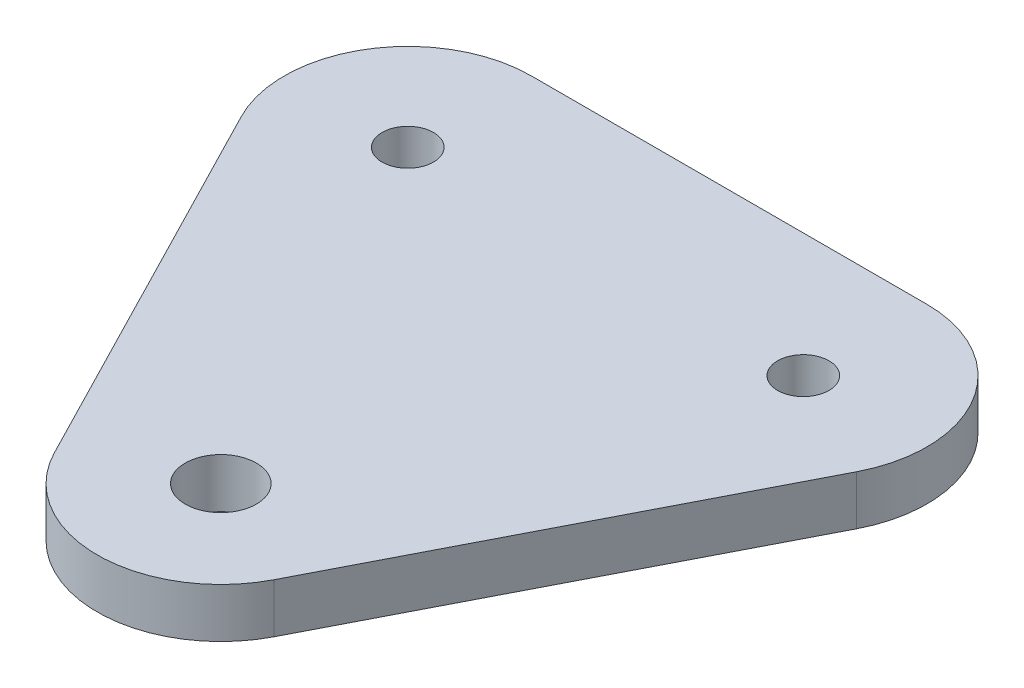
ISO-10303-21;
HEADER;
FILE_DESCRIPTION(('STEP AP214'),'2;1');
FILE_NAME('part.step','',(''),(''),'','','');
FILE_SCHEMA(('AUTOMOTIVE_DESIGN { 1 0 10303 214 1 1 1 1 }'));
ENDSEC;
DATA;
#1=APPLICATION_CONTEXT('core data for automotive mechanical design processes');
#2=APPLICATION_PROTOCOL_DEFINITION('international standard','automotive_design',2000,#1);
#3=PRODUCT_CONTEXT('',#1,'mechanical');
#4=PRODUCT('Part','Part','',(#3));
#5=PRODUCT_RELATED_PRODUCT_CATEGORY('part','',(#4));
#6=PRODUCT_DEFINITION_FORMATION('','',#4);
#7=PRODUCT_DEFINITION_CONTEXT('part definition',#1,'design');
#8=PRODUCT_DEFINITION('design','',#6,#7);
#9=PRODUCT_DEFINITION_SHAPE('','',#8);
#10=(LENGTH_UNIT() NAMED_UNIT(*) SI_UNIT(.MILLI.,.METRE.));
#11=(NAMED_UNIT(*) PLANE_ANGLE_UNIT() SI_UNIT($,.RADIAN.));
#12=(NAMED_UNIT(*) SI_UNIT($,.STERADIAN.) SOLID_ANGLE_UNIT());
#13=UNCERTAINTY_MEASURE_WITH_UNIT(LENGTH_MEASURE(1.E-05),#10,'distance_accuracy_value','');
#14=(GEOMETRIC_REPRESENTATION_CONTEXT(3) GLOBAL_UNCERTAINTY_ASSIGNED_CONTEXT((#13)) GLOBAL_UNIT_ASSIGNED_CONTEXT((#10,
#11,#12)) REPRESENTATION_CONTEXT('',''));
#15=CARTESIAN_POINT('',(0.,0.,0.));
#16=DIRECTION('',(0.,0.,1.));
#17=DIRECTION('',(1.,0.,0.));
#18=AXIS2_PLACEMENT_3D('',#15,#16,#17);
#19=CARTESIAN_POINT('',(-20.,5.,-14.314934837615));
#20=DIRECTION('',(0.,1.,0.));
#21=DIRECTION('',(0.,0.,1.));
#22=AXIS2_PLACEMENT_3D('',#19,#20,#21);
#23=PLANE('',#22);
#24=CARTESIAN_POINT('',(-20.,5.,-14.314934837615));
#25=DIRECTION('',(0.,1.,0.));
#26=DIRECTION('',(0.,0.,1.));
#27=AXIS2_PLACEMENT_3D('',#24,#25,#26);
#28=CIRCLE('',#27,2.59999999999999);
#29=CARTESIAN_POINT('',(-20.,5.,-11.714934837615));
#30=VERTEX_POINT('',#29);
#31=EDGE_CURVE('E211',#30,#30,#28,.T.);
#32=ORIENTED_EDGE('',*,*,#31,.F.);
#33=EDGE_LOOP('',(#32));
#34=FACE_BOUND('',#33,.T.);
#35=CARTESIAN_POINT('',(-20.,5.,-14.314934837615));
#36=DIRECTION('',(0.,1.,0.));
#37=DIRECTION('',(0.,0.,1.));
#38=AXIS2_PLACEMENT_3D('',#35,#36,#37);
#39=CIRCLE('',#38,12.5);
#40=CARTESIAN_POINT('',(-20.,5.,-26.814934837615));
#41=VERTEX_POINT('',#40);
#42=CARTESIAN_POINT('',(-31.117126255119,5.,-8.60008542334819));
#43=VERTEX_POINT('',#42);
#44=EDGE_CURVE('E150',#41,#43,#39,.T.);
#45=ORIENTED_EDGE('',*,*,#44,.T.);
#46=DIRECTION('',(0.45718795314135,0.,0.889370100409511));
#47=VECTOR('',#46,1.);
#48=CARTESIAN_POINT('',(-31.117126255119,5.,-8.60008542334819));
#49=LINE('',#48,#47);
#50=CARTESIAN_POINT('',(-11.1151221279727,5.,30.3099171187607));
#51=VERTEX_POINT('',#50);
#52=EDGE_CURVE('E98',#43,#51,#49,.T.);
#53=ORIENTED_EDGE('',*,*,#52,.T.);
#54=CARTESIAN_POINT('',(0.00200412714628038,5.,24.5950677044939));
#55=DIRECTION('',(0.,1.,0.));
#56=DIRECTION('',(0.,0.,1.));
#57=AXIS2_PLACEMENT_3D('',#54,#55,#56);
#58=CIRCLE('',#57,12.5000000000001);
#59=CARTESIAN_POINT('',(11.1195960194084,5.,30.3090112216376));
#60=VERTEX_POINT('',#59);
#61=EDGE_CURVE('E111',#51,#60,#58,.T.);
#62=ORIENTED_EDGE('',*,*,#61,.T.);
#63=DIRECTION('',(0.457115481371498,0.,-0.889407351380965));
#64=VECTOR('',#63,1.);
#65=CARTESIAN_POINT('',(11.1195960194084,5.,30.3090112216376));
#66=LINE('',#65,#64);
#67=CARTESIAN_POINT('',(31.1175918922621,5.,-8.60099132047127));
#68=VERTEX_POINT('',#67);
#69=EDGE_CURVE('E105',#60,#68,#66,.T.);
#70=ORIENTED_EDGE('',*,*,#69,.T.);
#71=CARTESIAN_POINT('',(20.,5.,-14.314934837615));
#72=DIRECTION('',(0.,1.,0.));
#73=DIRECTION('',(0.,0.,1.));
#74=AXIS2_PLACEMENT_3D('',#71,#72,#73);
#75=CIRCLE('',#74,12.5);
#76=CARTESIAN_POINT('',(20.,5.,-26.814934837615));
#77=VERTEX_POINT('',#76);
#78=EDGE_CURVE('E109',#68,#77,#75,.T.);
#79=ORIENTED_EDGE('',*,*,#78,.T.);
#80=DIRECTION('',(-1.,0.,0.));
#81=VECTOR('',#80,1.);
#82=CARTESIAN_POINT('',(20.,5.,-26.814934837615));
#83=LINE('',#82,#81);
#84=EDGE_CURVE('E61',#77,#41,#83,.T.);
#85=ORIENTED_EDGE('',*,*,#84,.T.);
#86=EDGE_LOOP('',(#45,#53,#62,#70,#79,#85));
#87=FACE_BOUND('',#86,.T.);
#88=CARTESIAN_POINT('',(20.,5.,-14.314934837615));
#89=DIRECTION('',(0.,1.,0.));
#90=DIRECTION('',(0.,0.,1.));
#91=AXIS2_PLACEMENT_3D('',#88,#89,#90);
#92=CIRCLE('',#91,2.59999999999997);
#93=CARTESIAN_POINT('',(20.,5.,-11.714934837615));
#94=VERTEX_POINT('',#93);
#95=EDGE_CURVE('E138',#94,#94,#92,.T.);
#96=ORIENTED_EDGE('',*,*,#95,.F.);
#97=EDGE_LOOP('',(#96));
#98=FACE_BOUND('',#97,.T.);
#99=CARTESIAN_POINT('',(0.00200412714628038,5.,24.5950677044939));
#100=DIRECTION('',(0.,1.,0.));
#101=DIRECTION('',(0.,0.,1.));
#102=AXIS2_PLACEMENT_3D('',#99,#100,#101);
#103=CIRCLE('',#102,3.6);
#104=CARTESIAN_POINT('',(0.00200412714628038,5.,28.1950677044939));
#105=VERTEX_POINT('',#104);
#106=EDGE_CURVE('E200',#105,#105,#103,.T.);
#107=ORIENTED_EDGE('',*,*,#106,.F.);
#108=EDGE_LOOP('',(#107));
#109=FACE_BOUND('',#108,.T.);
#110=ADVANCED_FACE('F43',(#34,#87,#98,#109),#23,.T.);
#111=CARTESIAN_POINT('',(-20.,0.,-14.314934837615));
#112=DIRECTION('',(0.,1.,0.));
#113=DIRECTION('',(0.,0.,1.));
#114=AXIS2_PLACEMENT_3D('',#111,#112,#113);
#115=PLANE('',#114);
#116=CARTESIAN_POINT('',(-20.,0.,-14.314934837615));
#117=DIRECTION('',(0.,1.,0.));
#118=DIRECTION('',(0.,0.,1.));
#119=AXIS2_PLACEMENT_3D('',#116,#117,#118);
#120=CIRCLE('',#119,12.5);
#121=CARTESIAN_POINT('',(-20.,0.,-26.814934837615));
#122=VERTEX_POINT('',#121);
#123=CARTESIAN_POINT('',(-31.117126255119,0.,-8.60008542334819));
#124=VERTEX_POINT('',#123);
#125=EDGE_CURVE('E133',#122,#124,#120,.T.);
#126=ORIENTED_EDGE('',*,*,#125,.F.);
#127=DIRECTION('',(-1.,0.,0.));
#128=VECTOR('',#127,1.);
#129=CARTESIAN_POINT('',(20.,0.,-26.814934837615));
#130=LINE('',#129,#128);
#131=CARTESIAN_POINT('',(20.,0.,-26.814934837615));
#132=VERTEX_POINT('',#131);
#133=EDGE_CURVE('E90',#132,#122,#130,.T.);
#134=ORIENTED_EDGE('',*,*,#133,.F.);
#135=CARTESIAN_POINT('',(20.,0.,-14.314934837615));
#136=DIRECTION('',(0.,1.,0.));
#137=DIRECTION('',(0.,0.,1.));
#138=AXIS2_PLACEMENT_3D('',#135,#136,#137);
#139=CIRCLE('',#138,12.5);
#140=CARTESIAN_POINT('',(31.1175918922621,0.,-8.60099132047127));
#141=VERTEX_POINT('',#140);
#142=EDGE_CURVE('E84',#141,#132,#139,.T.);
#143=ORIENTED_EDGE('',*,*,#142,.F.);
#144=DIRECTION('',(0.457115481371498,0.,-0.889407351380965));
#145=VECTOR('',#144,1.);
#146=CARTESIAN_POINT('',(11.1195960194084,0.,30.3090112216376));
#147=LINE('',#146,#145);
#148=CARTESIAN_POINT('',(11.1195960194084,0.,30.3090112216376));
#149=VERTEX_POINT('',#148);
#150=EDGE_CURVE('E120',#149,#141,#147,.T.);
#151=ORIENTED_EDGE('',*,*,#150,.F.);
#152=CARTESIAN_POINT('',(0.00200412714628038,0.,24.5950677044939));
#153=DIRECTION('',(0.,1.,0.));
#154=DIRECTION('',(0.,0.,1.));
#155=AXIS2_PLACEMENT_3D('',#152,#153,#154);
#156=CIRCLE('',#155,12.5000000000001);
#157=CARTESIAN_POINT('',(-11.1151221279727,0.,30.3099171187607));
#158=VERTEX_POINT('',#157);
#159=EDGE_CURVE('E141',#158,#149,#156,.T.);
#160=ORIENTED_EDGE('',*,*,#159,.F.);
#161=DIRECTION('',(0.45718795314135,0.,0.889370100409511));
#162=VECTOR('',#161,1.);
#163=CARTESIAN_POINT('',(-31.117126255119,0.,-8.60008542334819));
#164=LINE('',#163,#162);
#165=EDGE_CURVE('E137',#124,#158,#164,.T.);
#166=ORIENTED_EDGE('',*,*,#165,.F.);
#167=EDGE_LOOP('',(#126,#134,#143,#151,#160,#166));
#168=FACE_BOUND('',#167,.T.);
#169=CARTESIAN_POINT('',(20.,0.,-14.314934837615));
#170=DIRECTION('',(0.,1.,0.));
#171=DIRECTION('',(0.,0.,1.));
#172=AXIS2_PLACEMENT_3D('',#169,#170,#171);
#173=CIRCLE('',#172,2.59999999999997);
#174=CARTESIAN_POINT('',(20.,0.,-11.714934837615));
#175=VERTEX_POINT('',#174);
#176=EDGE_CURVE('E215',#175,#175,#173,.T.);
#177=ORIENTED_EDGE('',*,*,#176,.T.);
#178=EDGE_LOOP('',(#177));
#179=FACE_BOUND('',#178,.T.);
#180=CARTESIAN_POINT('',(-20.,0.,-14.314934837615));
#181=DIRECTION('',(0.,1.,0.));
#182=DIRECTION('',(0.,0.,1.));
#183=AXIS2_PLACEMENT_3D('',#180,#181,#182);
#184=CIRCLE('',#183,2.59999999999999);
#185=CARTESIAN_POINT('',(-20.,0.,-11.714934837615));
#186=VERTEX_POINT('',#185);
#187=EDGE_CURVE('E208',#186,#186,#184,.T.);
#188=ORIENTED_EDGE('',*,*,#187,.T.);
#189=EDGE_LOOP('',(#188));
#190=FACE_BOUND('',#189,.T.);
#191=CARTESIAN_POINT('',(0.00200412714628038,0.,24.5950677044939));
#192=DIRECTION('',(0.,1.,0.));
#193=DIRECTION('',(0.,0.,1.));
#194=AXIS2_PLACEMENT_3D('',#191,#192,#193);
#195=CIRCLE('',#194,3.6);
#196=CARTESIAN_POINT('',(0.00200412714628038,0.,28.1950677044939));
#197=VERTEX_POINT('',#196);
#198=EDGE_CURVE('E203',#197,#197,#195,.T.);
#199=ORIENTED_EDGE('',*,*,#198,.T.);
#200=EDGE_LOOP('',(#199));
#201=FACE_BOUND('',#200,.T.);
#202=ADVANCED_FACE('F163',(#168,#179,#190,#201),#115,.F.);
#203=CARTESIAN_POINT('',(-20.,5.,-14.314934837615));
#204=DIRECTION('',(0.,-1.,0.));
#205=DIRECTION('',(0.,0.,-1.));
#206=AXIS2_PLACEMENT_3D('',#203,#204,#205);
#207=CYLINDRICAL_SURFACE('',#206,12.5);
#208=ORIENTED_EDGE('',*,*,#125,.T.);
#209=DIRECTION('',(0.,-1.,0.));
#210=VECTOR('',#209,1.);
#211=CARTESIAN_POINT('',(-31.117126255119,5.,-8.60008542334819));
#212=LINE('',#211,#210);
#213=EDGE_CURVE('E11',#43,#124,#212,.T.);
#214=ORIENTED_EDGE('',*,*,#213,.F.);
#215=ORIENTED_EDGE('',*,*,#44,.F.);
#216=DIRECTION('',(0.,-1.,0.));
#217=VECTOR('',#216,1.);
#218=CARTESIAN_POINT('',(-20.,5.,-26.814934837615));
#219=LINE('',#218,#217);
#220=EDGE_CURVE('E129',#41,#122,#219,.T.);
#221=ORIENTED_EDGE('',*,*,#220,.T.);
#222=EDGE_LOOP('',(#208,#214,#215,#221));
#223=FACE_BOUND('',#222,.T.);
#224=ADVANCED_FACE('F45',(#223),#207,.T.);
#225=CARTESIAN_POINT('',(-31.117126255119,5.,-8.60008542334819));
#226=DIRECTION('',(0.889370100409511,0.,-0.45718795314135));
#227=DIRECTION('',(-0.45718795314135,0.,-0.889370100409511));
#228=AXIS2_PLACEMENT_3D('',#225,#226,#227);
#229=PLANE('',#228);
#230=ORIENTED_EDGE('',*,*,#165,.T.);
#231=DIRECTION('',(0.,-1.,0.));
#232=VECTOR('',#231,1.);
#233=CARTESIAN_POINT('',(-11.1151221279727,5.,30.3099171187607));
#234=LINE('',#233,#232);
#235=EDGE_CURVE('E53',#51,#158,#234,.T.);
#236=ORIENTED_EDGE('',*,*,#235,.F.);
#237=ORIENTED_EDGE('',*,*,#52,.F.);
#238=ORIENTED_EDGE('',*,*,#213,.T.);
#239=EDGE_LOOP('',(#230,#236,#237,#238));
#240=FACE_BOUND('',#239,.T.);
#241=ADVANCED_FACE('F275',(#240),#229,.F.);
#242=CARTESIAN_POINT('',(0.00200412714628038,5.,24.5950677044939));
#243=DIRECTION('',(0.,-1.,0.));
#244=DIRECTION('',(0.,0.,-1.));
#245=AXIS2_PLACEMENT_3D('',#242,#243,#244);
#246=CYLINDRICAL_SURFACE('',#245,12.5000000000001);
#247=ORIENTED_EDGE('',*,*,#159,.T.);
#248=DIRECTION('',(0.,-1.,0.));
#249=VECTOR('',#248,1.);
#250=CARTESIAN_POINT('',(11.1195960194084,5.,30.3090112216376));
#251=LINE('',#250,#249);
#252=EDGE_CURVE('E122',#60,#149,#251,.T.);
#253=ORIENTED_EDGE('',*,*,#252,.F.);
#254=ORIENTED_EDGE('',*,*,#61,.F.);
#255=ORIENTED_EDGE('',*,*,#235,.T.);
#256=EDGE_LOOP('',(#247,#253,#254,#255));
#257=FACE_BOUND('',#256,.T.);
#258=ADVANCED_FACE('F160',(#257),#246,.T.);
#259=CARTESIAN_POINT('',(11.1195960194084,5.,30.3090112216376));
#260=DIRECTION('',(-0.889407351380965,0.,-0.457115481371498));
#261=DIRECTION('',(-0.457115481371498,0.,0.889407351380965));
#262=AXIS2_PLACEMENT_3D('',#259,#260,#261);
#263=PLANE('',#262);
#264=ORIENTED_EDGE('',*,*,#150,.T.);
#265=DIRECTION('',(0.,-1.,0.));
#266=VECTOR('',#265,1.);
#267=CARTESIAN_POINT('',(31.1175918922621,5.,-8.60099132047127));
#268=LINE('',#267,#266);
#269=EDGE_CURVE('E117',#68,#141,#268,.T.);
#270=ORIENTED_EDGE('',*,*,#269,.F.);
#271=ORIENTED_EDGE('',*,*,#69,.F.);
#272=ORIENTED_EDGE('',*,*,#252,.T.);
#273=EDGE_LOOP('',(#264,#270,#271,#272));
#274=FACE_BOUND('',#273,.T.);
#275=ADVANCED_FACE('F118',(#274),#263,.F.);
#276=CARTESIAN_POINT('',(20.,5.,-14.314934837615));
#277=DIRECTION('',(0.,-1.,0.));
#278=DIRECTION('',(0.,0.,-1.));
#279=AXIS2_PLACEMENT_3D('',#276,#277,#278);
#280=CYLINDRICAL_SURFACE('',#279,12.5);
#281=ORIENTED_EDGE('',*,*,#142,.T.);
#282=DIRECTION('',(0.,-1.,0.));
#283=VECTOR('',#282,1.);
#284=CARTESIAN_POINT('',(20.,5.,-26.814934837615));
#285=LINE('',#284,#283);
#286=EDGE_CURVE('E123',#77,#132,#285,.T.);
#287=ORIENTED_EDGE('',*,*,#286,.F.);
#288=ORIENTED_EDGE('',*,*,#78,.F.);
#289=ORIENTED_EDGE('',*,*,#269,.T.);
#290=EDGE_LOOP('',(#281,#287,#288,#289));
#291=FACE_BOUND('',#290,.T.);
#292=ADVANCED_FACE('F125',(#291),#280,.T.);
#293=CARTESIAN_POINT('',(20.,5.,-26.814934837615));
#294=DIRECTION('',(0.,0.,1.));
#295=DIRECTION('',(1.,0.,0.));
#296=AXIS2_PLACEMENT_3D('',#293,#294,#295);
#297=PLANE('',#296);
#298=ORIENTED_EDGE('',*,*,#133,.T.);
#299=ORIENTED_EDGE('',*,*,#220,.F.);
#300=ORIENTED_EDGE('',*,*,#84,.F.);
#301=ORIENTED_EDGE('',*,*,#286,.T.);
#302=EDGE_LOOP('',(#298,#299,#300,#301));
#303=FACE_BOUND('',#302,.T.);
#304=ADVANCED_FACE('F168',(#303),#297,.F.);
#305=CARTESIAN_POINT('',(20.,5.,-14.314934837615));
#306=DIRECTION('',(0.,-1.,0.));
#307=DIRECTION('',(0.,0.,-1.));
#308=AXIS2_PLACEMENT_3D('',#305,#306,#307);
#309=CYLINDRICAL_SURFACE('',#308,2.59999999999997);
#310=ORIENTED_EDGE('',*,*,#95,.T.);
#311=EDGE_LOOP('',(#310));
#312=FACE_BOUND('',#311,.T.);
#313=ORIENTED_EDGE('',*,*,#176,.F.);
#314=EDGE_LOOP('',(#313));
#315=FACE_BOUND('',#314,.T.);
#316=ADVANCED_FACE('F170',(#312,#315),#309,.F.);
#317=CARTESIAN_POINT('',(-20.,5.,-14.314934837615));
#318=DIRECTION('',(0.,-1.,0.));
#319=DIRECTION('',(0.,0.,-1.));
#320=AXIS2_PLACEMENT_3D('',#317,#318,#319);
#321=CYLINDRICAL_SURFACE('',#320,2.59999999999999);
#322=ORIENTED_EDGE('',*,*,#31,.T.);
#323=EDGE_LOOP('',(#322));
#324=FACE_BOUND('',#323,.T.);
#325=ORIENTED_EDGE('',*,*,#187,.F.);
#326=EDGE_LOOP('',(#325));
#327=FACE_BOUND('',#326,.T.);
#328=ADVANCED_FACE('F176',(#324,#327),#321,.F.);
#329=CARTESIAN_POINT('',(0.00200412714628038,5.,24.5950677044939));
#330=DIRECTION('',(0.,-1.,0.));
#331=DIRECTION('',(0.,0.,-1.));
#332=AXIS2_PLACEMENT_3D('',#329,#330,#331);
#333=CYLINDRICAL_SURFACE('',#332,3.6);
#334=ORIENTED_EDGE('',*,*,#106,.T.);
#335=EDGE_LOOP('',(#334));
#336=FACE_BOUND('',#335,.T.);
#337=ORIENTED_EDGE('',*,*,#198,.F.);
#338=EDGE_LOOP('',(#337));
#339=FACE_BOUND('',#338,.T.);
#340=ADVANCED_FACE('F191',(#336,#339),#333,.F.);
#341=CLOSED_SHELL('',(#110,#202,#224,#241,#258,#275,#292,#304,#316,#328,#340));
#342=MANIFOLD_SOLID_BREP('B2',#341);
#343=ADVANCED_BREP_SHAPE_REPRESENTATION('',(#18,#342),#14);
#344=SHAPE_DEFINITION_REPRESENTATION(#9,#343);
ENDSEC;
END-ISO-10303-21;
